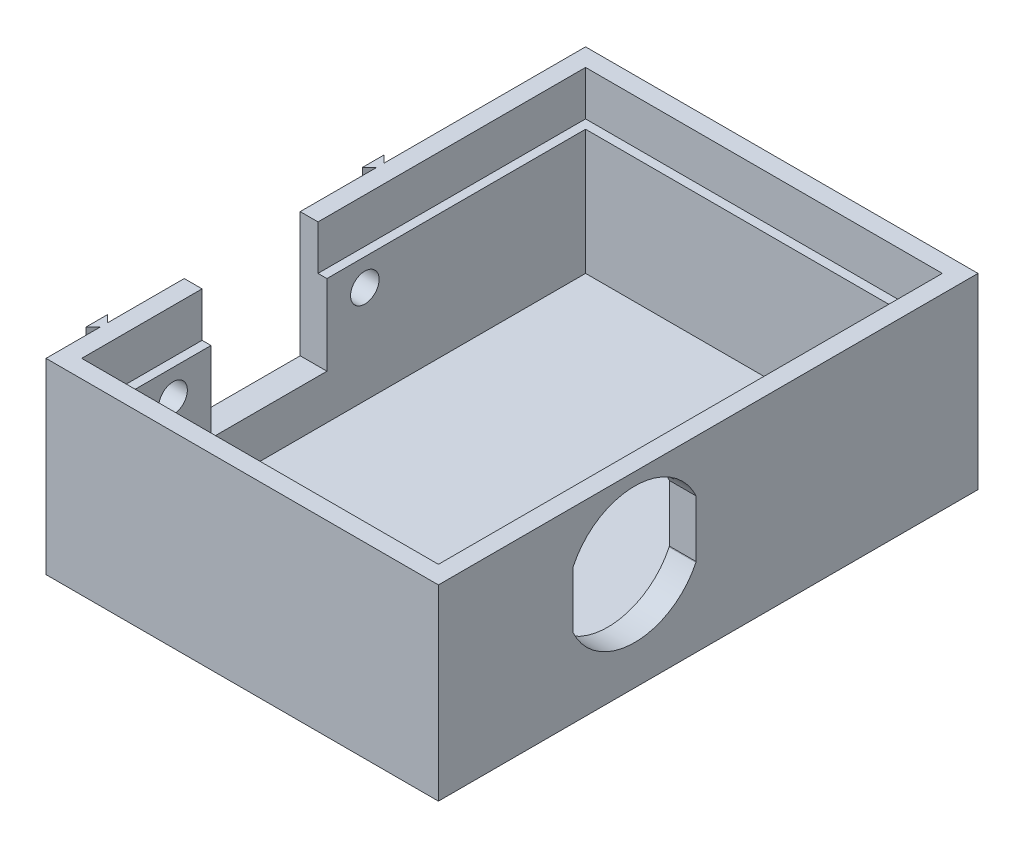
ISO-10303-21;
HEADER;
FILE_DESCRIPTION(('STEP AP214'),'2;1');
FILE_NAME('part.step','',(''),(''),'','','');
FILE_SCHEMA(('AUTOMOTIVE_DESIGN { 1 0 10303 214 1 1 1 1 }'));
ENDSEC;
DATA;
#1=APPLICATION_CONTEXT('core data for automotive mechanical design processes');
#2=APPLICATION_PROTOCOL_DEFINITION('international standard','automotive_design',2000,#1);
#3=PRODUCT_CONTEXT('',#1,'mechanical');
#4=PRODUCT('Part','Part','',(#3));
#5=PRODUCT_RELATED_PRODUCT_CATEGORY('part','',(#4));
#6=PRODUCT_DEFINITION_FORMATION('','',#4);
#7=PRODUCT_DEFINITION_CONTEXT('part definition',#1,'design');
#8=PRODUCT_DEFINITION('design','',#6,#7);
#9=PRODUCT_DEFINITION_SHAPE('','',#8);
#10=(LENGTH_UNIT() NAMED_UNIT(*) SI_UNIT(.MILLI.,.METRE.));
#11=(NAMED_UNIT(*) PLANE_ANGLE_UNIT() SI_UNIT($,.RADIAN.));
#12=(NAMED_UNIT(*) SI_UNIT($,.STERADIAN.) SOLID_ANGLE_UNIT());
#13=UNCERTAINTY_MEASURE_WITH_UNIT(LENGTH_MEASURE(1.E-05),#10,'distance_accuracy_value','');
#14=(GEOMETRIC_REPRESENTATION_CONTEXT(3) GLOBAL_UNCERTAINTY_ASSIGNED_CONTEXT((#13)) GLOBAL_UNIT_ASSIGNED_CONTEXT((#10,
#11,#12)) REPRESENTATION_CONTEXT('',''));
#15=CARTESIAN_POINT('',(0.,0.,0.));
#16=DIRECTION('',(0.,0.,1.));
#17=DIRECTION('',(1.,0.,0.));
#18=AXIS2_PLACEMENT_3D('',#15,#16,#17);
#19=CARTESIAN_POINT('',(0.,16.,0.));
#20=DIRECTION('',(0.,1.,0.));
#21=DIRECTION('',(0.,0.,1.));
#22=AXIS2_PLACEMENT_3D('',#19,#20,#21);
#23=PLANE('',#22);
#24=DIRECTION('',(1.,0.,0.));
#25=VECTOR('',#24,1.);
#26=CARTESIAN_POINT('',(12.,16.,-1.76823879571511));
#27=LINE('',#26,#25);
#28=CARTESIAN_POINT('',(19.,16.,-1.76823879571511));
#29=VERTEX_POINT('',#28);
#30=CARTESIAN_POINT('',(20.,16.,-1.76823879571511));
#31=VERTEX_POINT('',#30);
#32=EDGE_CURVE('E60',#29,#31,#27,.T.);
#33=ORIENTED_EDGE('',*,*,#32,.F.);
#34=DIRECTION('',(0.,0.,-1.));
#35=VECTOR('',#34,1.);
#36=CARTESIAN_POINT('',(19.,16.,10.7695634357235));
#37=LINE('',#36,#35);
#38=CARTESIAN_POINT('',(19.,16.,10.7695634357235));
#39=VERTEX_POINT('',#38);
#40=EDGE_CURVE('E354',#39,#29,#37,.T.);
#41=ORIENTED_EDGE('',*,*,#40,.F.);
#42=DIRECTION('',(1.,0.,0.));
#43=VECTOR('',#42,1.);
#44=CARTESIAN_POINT('',(-19.,16.,10.7695634357235));
#45=LINE('',#44,#43);
#46=CARTESIAN_POINT('',(-19.,16.,10.7695634357235));
#47=VERTEX_POINT('',#46);
#48=EDGE_CURVE('E350',#47,#39,#45,.T.);
#49=ORIENTED_EDGE('',*,*,#48,.F.);
#50=DIRECTION('',(0.,0.,1.));
#51=VECTOR('',#50,1.);
#52=CARTESIAN_POINT('',(-19.,16.,10.7695634357235));
#53=LINE('',#52,#51);
#54=CARTESIAN_POINT('',(-19.,16.,-1.73043656427652));
#55=VERTEX_POINT('',#54);
#56=EDGE_CURVE('E340',#55,#47,#53,.T.);
#57=ORIENTED_EDGE('',*,*,#56,.F.);
#58=DIRECTION('',(-1.,0.,0.));
#59=VECTOR('',#58,1.);
#60=CARTESIAN_POINT('',(-22.,16.,-1.73043656427652));
#61=LINE('',#60,#59);
#62=CARTESIAN_POINT('',(-20.,16.,-1.73043656427652));
#63=VERTEX_POINT('',#62);
#64=EDGE_CURVE('E400',#55,#63,#61,.T.);
#65=ORIENTED_EDGE('',*,*,#64,.T.);
#66=DIRECTION('',(0.,0.,1.));
#67=VECTOR('',#66,1.);
#68=CARTESIAN_POINT('',(-20.,16.,11.7695634357235));
#69=LINE('',#68,#67);
#70=CARTESIAN_POINT('',(-20.,16.,11.7695634357235));
#71=VERTEX_POINT('',#70);
#72=EDGE_CURVE('E372',#63,#71,#69,.T.);
#73=ORIENTED_EDGE('',*,*,#72,.T.);
#74=DIRECTION('',(1.,0.,0.));
#75=VECTOR('',#74,1.);
#76=CARTESIAN_POINT('',(-20.,16.,11.7695634357235));
#77=LINE('',#76,#75);
#78=CARTESIAN_POINT('',(20.,16.,11.7695634357235));
#79=VERTEX_POINT('',#78);
#80=EDGE_CURVE('E361',#71,#79,#77,.T.);
#81=ORIENTED_EDGE('',*,*,#80,.T.);
#82=DIRECTION('',(0.,0.,-1.));
#83=VECTOR('',#82,1.);
#84=CARTESIAN_POINT('',(20.,16.,11.7695634357235));
#85=LINE('',#84,#83);
#86=EDGE_CURVE('E366',#79,#31,#85,.T.);
#87=ORIENTED_EDGE('',*,*,#86,.T.);
#88=EDGE_LOOP('',(#33,#41,#49,#57,#65,#73,#81,#87));
#89=FACE_BOUND('',#88,.T.);
#90=ADVANCED_FACE('F35',(#89),#23,.T.);
#91=CARTESIAN_POINT('',(-22.,2.,13.7695634357235));
#92=DIRECTION('',(1.,0.,0.));
#93=DIRECTION('',(0.,0.,-1.));
#94=AXIS2_PLACEMENT_3D('',#91,#92,#93);
#95=PLANE('',#94);
#96=CARTESIAN_POINT('',(-22.,13.,-18.9804365642765));
#97=DIRECTION('',(-1.,0.,0.));
#98=DIRECTION('',(0.,0.,1.));
#99=AXIS2_PLACEMENT_3D('',#96,#97,#98);
#100=CIRCLE('',#99,1.6);
#101=CARTESIAN_POINT('',(-22.,13.,-17.3804365642765));
#102=VERTEX_POINT('',#101);
#103=EDGE_CURVE('E507',#102,#102,#100,.T.);
#104=ORIENTED_EDGE('',*,*,#103,.F.);
#105=EDGE_LOOP('',(#104));
#106=FACE_BOUND('',#105,.T.);
#107=CARTESIAN_POINT('',(-22.,13.,2.51956343572347));
#108=DIRECTION('',(-1.,0.,0.));
#109=DIRECTION('',(0.,0.,-1.));
#110=AXIS2_PLACEMENT_3D('',#107,#108,#109);
#111=CIRCLE('',#110,1.6);
#112=CARTESIAN_POINT('',(-22.,13.,0.919563435723472));
#113=VERTEX_POINT('',#112);
#114=EDGE_CURVE('E512',#113,#113,#111,.T.);
#115=ORIENTED_EDGE('',*,*,#114,.F.);
#116=EDGE_LOOP('',(#115));
#117=FACE_BOUND('',#116,.T.);
#118=DIRECTION('',(0.,0.,1.));
#119=VECTOR('',#118,1.);
#120=CARTESIAN_POINT('',(-22.,4.4,13.7695634357235));
#121=LINE('',#120,#119);
#122=CARTESIAN_POINT('',(-22.,4.4,7.66956343572348));
#123=VERTEX_POINT('',#122);
#124=CARTESIAN_POINT('',(-22.,4.4,6.86956343572347));
#125=VERTEX_POINT('',#124);
#126=EDGE_CURVE('E494',#123,#125,#121,.F.);
#127=ORIENTED_EDGE('',*,*,#126,.T.);
#128=DIRECTION('',(0.,1.,0.));
#129=VECTOR('',#128,1.);
#130=CARTESIAN_POINT('',(-22.,6.,6.86956343572347));
#131=LINE('',#130,#129);
#132=CARTESIAN_POINT('',(-22.,21.,6.86956343572347));
#133=VERTEX_POINT('',#132);
#134=EDGE_CURVE('E329',#125,#133,#131,.T.);
#135=ORIENTED_EDGE('',*,*,#134,.T.);
#136=DIRECTION('',(0.,0.,1.));
#137=VECTOR('',#136,1.);
#138=CARTESIAN_POINT('',(-22.,21.,13.7695634357235));
#139=LINE('',#138,#137);
#140=CARTESIAN_POINT('',(-22.,21.,-1.73043656427652));
#141=VERTEX_POINT('',#140);
#142=EDGE_CURVE('E434',#141,#133,#139,.T.);
#143=ORIENTED_EDGE('',*,*,#142,.F.);
#144=DIRECTION('',(0.,-1.,0.));
#145=VECTOR('',#144,1.);
#146=CARTESIAN_POINT('',(-22.,21.,-1.73043656427652));
#147=LINE('',#146,#145);
#148=CARTESIAN_POINT('',(-22.,7.,-1.73043656427652));
#149=VERTEX_POINT('',#148);
#150=EDGE_CURVE('E440',#141,#149,#147,.T.);
#151=ORIENTED_EDGE('',*,*,#150,.T.);
#152=DIRECTION('',(0.,0.,1.));
#153=VECTOR('',#152,1.);
#154=CARTESIAN_POINT('',(-22.,7.,-14.7304365642765));
#155=LINE('',#154,#153);
#156=CARTESIAN_POINT('',(-22.,7.,-14.7304365642765));
#157=VERTEX_POINT('',#156);
#158=EDGE_CURVE('E410',#157,#149,#155,.T.);
#159=ORIENTED_EDGE('',*,*,#158,.F.);
#160=DIRECTION('',(0.,-1.,0.));
#161=VECTOR('',#160,1.);
#162=CARTESIAN_POINT('',(-22.,21.,-14.7304365642765));
#163=LINE('',#162,#161);
#164=CARTESIAN_POINT('',(-22.,21.,-14.7304365642765));
#165=VERTEX_POINT('',#164);
#166=EDGE_CURVE('E465',#165,#157,#163,.T.);
#167=ORIENTED_EDGE('',*,*,#166,.F.);
#168=DIRECTION('',(0.,0.,1.));
#169=VECTOR('',#168,1.);
#170=CARTESIAN_POINT('',(-22.,21.,-14.7304365642765));
#171=LINE('',#170,#169);
#172=CARTESIAN_POINT('',(-22.,21.,-23.3304365642765));
#173=VERTEX_POINT('',#172);
#174=EDGE_CURVE('E424',#173,#165,#171,.T.);
#175=ORIENTED_EDGE('',*,*,#174,.F.);
#176=DIRECTION('',(0.,1.,0.));
#177=VECTOR('',#176,1.);
#178=CARTESIAN_POINT('',(-22.,6.,-23.3304365642765));
#179=LINE('',#178,#177);
#180=CARTESIAN_POINT('',(-22.,4.39999999999999,-23.3304365642765));
#181=VERTEX_POINT('',#180);
#182=EDGE_CURVE('E320',#181,#173,#179,.T.);
#183=ORIENTED_EDGE('',*,*,#182,.F.);
#184=DIRECTION('',(0.,0.,-1.));
#185=VECTOR('',#184,1.);
#186=CARTESIAN_POINT('',(-22.,4.39999999999999,13.7695634357235));
#187=LINE('',#186,#185);
#188=CARTESIAN_POINT('',(-22.,4.39999999999999,-24.1304365642765));
#189=VERTEX_POINT('',#188);
#190=EDGE_CURVE('E491',#181,#189,#187,.T.);
#191=ORIENTED_EDGE('',*,*,#190,.T.);
#192=DIRECTION('',(0.,1.,0.));
#193=VECTOR('',#192,1.);
#194=CARTESIAN_POINT('',(-22.,6.,-24.1304365642765));
#195=LINE('',#194,#193);
#196=CARTESIAN_POINT('',(-22.,21.,-24.1304365642765));
#197=VERTEX_POINT('',#196);
#198=EDGE_CURVE('E316',#189,#197,#195,.T.);
#199=ORIENTED_EDGE('',*,*,#198,.T.);
#200=CARTESIAN_POINT('',(-22.,21.,-46.7304365642765));
#201=VERTEX_POINT('',#200);
#202=EDGE_CURVE('E425',#201,#197,#171,.T.);
#203=ORIENTED_EDGE('',*,*,#202,.F.);
#204=DIRECTION('',(0.,-1.,0.));
#205=VECTOR('',#204,1.);
#206=CARTESIAN_POINT('',(-22.,2.,-46.7304365642765));
#207=LINE('',#206,#205);
#208=CARTESIAN_POINT('',(-22.,0.,-46.7304365642765));
#209=VERTEX_POINT('',#208);
#210=EDGE_CURVE('E482',#201,#209,#207,.T.);
#211=ORIENTED_EDGE('',*,*,#210,.T.);
#212=DIRECTION('',(0.,0.,1.));
#213=VECTOR('',#212,1.);
#214=CARTESIAN_POINT('',(-22.,0.,13.7695634357235));
#215=LINE('',#214,#213);
#216=CARTESIAN_POINT('',(-22.,0.,13.7695634357235));
#217=VERTEX_POINT('',#216);
#218=EDGE_CURVE('E472',#209,#217,#215,.T.);
#219=ORIENTED_EDGE('',*,*,#218,.T.);
#220=DIRECTION('',(0.,-1.,0.));
#221=VECTOR('',#220,1.);
#222=CARTESIAN_POINT('',(-22.,2.,13.7695634357235));
#223=LINE('',#222,#221);
#224=CARTESIAN_POINT('',(-22.,21.,13.7695634357235));
#225=VERTEX_POINT('',#224);
#226=EDGE_CURVE('E479',#225,#217,#223,.T.);
#227=ORIENTED_EDGE('',*,*,#226,.F.);
#228=CARTESIAN_POINT('',(-22.,21.,7.66956343572348));
#229=VERTEX_POINT('',#228);
#230=EDGE_CURVE('E433',#229,#225,#139,.T.);
#231=ORIENTED_EDGE('',*,*,#230,.F.);
#232=DIRECTION('',(0.,1.,0.));
#233=VECTOR('',#232,1.);
#234=CARTESIAN_POINT('',(-22.,6.,7.66956343572348));
#235=LINE('',#234,#233);
#236=EDGE_CURVE('E338',#123,#229,#235,.T.);
#237=ORIENTED_EDGE('',*,*,#236,.F.);
#238=EDGE_LOOP('',(#127,#135,#143,#151,#159,#167,#175,#183,#191,#199,#203,#211,#219,#227,#231,#237));
#239=FACE_BOUND('',#238,.T.);
#240=ADVANCED_FACE('F523',(#106,#117,#239),#95,.F.);
#241=CARTESIAN_POINT('',(-19.,21.,-14.7304365642765));
#242=DIRECTION('',(-1.,0.,0.));
#243=DIRECTION('',(0.,0.,1.));
#244=AXIS2_PLACEMENT_3D('',#241,#242,#243);
#245=PLANE('',#244);
#246=CARTESIAN_POINT('',(-19.,13.,-18.9804365642765));
#247=DIRECTION('',(-1.,0.,0.));
#248=DIRECTION('',(0.,0.,1.));
#249=AXIS2_PLACEMENT_3D('',#246,#247,#248);
#250=CIRCLE('',#249,1.6);
#251=CARTESIAN_POINT('',(-19.,13.,-17.3804365642765));
#252=VERTEX_POINT('',#251);
#253=EDGE_CURVE('E39',#252,#252,#250,.T.);
#254=ORIENTED_EDGE('',*,*,#253,.T.);
#255=EDGE_LOOP('',(#254));
#256=FACE_BOUND('',#255,.T.);
#257=CARTESIAN_POINT('',(-19.,13.,2.51956343572347));
#258=DIRECTION('',(-1.,0.,0.));
#259=DIRECTION('',(0.,0.,1.));
#260=AXIS2_PLACEMENT_3D('',#257,#258,#259);
#261=CIRCLE('',#260,1.6);
#262=CARTESIAN_POINT('',(-19.,13.,4.11956343572348));
#263=VERTEX_POINT('',#262);
#264=EDGE_CURVE('E505',#263,#263,#261,.T.);
#265=ORIENTED_EDGE('',*,*,#264,.T.);
#266=EDGE_LOOP('',(#265));
#267=FACE_BOUND('',#266,.T.);
#268=ORIENTED_EDGE('',*,*,#56,.T.);
#269=DIRECTION('',(0.,-1.,0.));
#270=VECTOR('',#269,1.);
#271=CARTESIAN_POINT('',(-19.,21.,10.7695634357235));
#272=LINE('',#271,#270);
#273=CARTESIAN_POINT('',(-19.,2.,10.7695634357235));
#274=VERTEX_POINT('',#273);
#275=EDGE_CURVE('E455',#47,#274,#272,.T.);
#276=ORIENTED_EDGE('',*,*,#275,.T.);
#277=DIRECTION('',(0.,0.,-1.));
#278=VECTOR('',#277,1.);
#279=CARTESIAN_POINT('',(-19.,2.,-14.7304365642765));
#280=LINE('',#279,#278);
#281=CARTESIAN_POINT('',(-19.,2.,-43.7304365642765));
#282=VERTEX_POINT('',#281);
#283=EDGE_CURVE('E416',#274,#282,#280,.T.);
#284=ORIENTED_EDGE('',*,*,#283,.T.);
#285=DIRECTION('',(0.,-1.,0.));
#286=VECTOR('',#285,1.);
#287=CARTESIAN_POINT('',(-19.,21.,-43.7304365642765));
#288=LINE('',#287,#286);
#289=CARTESIAN_POINT('',(-19.,16.,-43.7304365642765));
#290=VERTEX_POINT('',#289);
#291=EDGE_CURVE('E461',#290,#282,#288,.T.);
#292=ORIENTED_EDGE('',*,*,#291,.F.);
#293=CARTESIAN_POINT('',(-19.,16.,-14.7304365642765));
#294=VERTEX_POINT('',#293);
#295=EDGE_CURVE('E347',#290,#294,#53,.T.);
#296=ORIENTED_EDGE('',*,*,#295,.T.);
#297=DIRECTION('',(0.,-1.,0.));
#298=VECTOR('',#297,1.);
#299=CARTESIAN_POINT('',(-19.,21.,-14.7304365642765));
#300=LINE('',#299,#298);
#301=CARTESIAN_POINT('',(-19.,7.,-14.7304365642765));
#302=VERTEX_POINT('',#301);
#303=EDGE_CURVE('E463',#294,#302,#300,.T.);
#304=ORIENTED_EDGE('',*,*,#303,.T.);
#305=DIRECTION('',(0.,0.,-1.));
#306=VECTOR('',#305,1.);
#307=CARTESIAN_POINT('',(-19.,7.,-14.7304365642765));
#308=LINE('',#307,#306);
#309=CARTESIAN_POINT('',(-19.,7.,-1.73043656427652));
#310=VERTEX_POINT('',#309);
#311=EDGE_CURVE('E404',#310,#302,#308,.T.);
#312=ORIENTED_EDGE('',*,*,#311,.F.);
#313=DIRECTION('',(0.,-1.,0.));
#314=VECTOR('',#313,1.);
#315=CARTESIAN_POINT('',(-19.,21.,-1.73043656427652));
#316=LINE('',#315,#314);
#317=EDGE_CURVE('E453',#55,#310,#316,.T.);
#318=ORIENTED_EDGE('',*,*,#317,.F.);
#319=EDGE_LOOP('',(#268,#276,#284,#292,#296,#304,#312,#318));
#320=FACE_BOUND('',#319,.T.);
#321=ADVANCED_FACE('F526',(#256,#267,#320),#245,.F.);
#322=CARTESIAN_POINT('',(-19.,21.,-43.7304365642765));
#323=DIRECTION('',(0.,0.,-1.));
#324=DIRECTION('',(-1.,0.,0.));
#325=AXIS2_PLACEMENT_3D('',#322,#323,#324);
#326=PLANE('',#325);
#327=DIRECTION('',(-1.,0.,0.));
#328=VECTOR('',#327,1.);
#329=CARTESIAN_POINT('',(-19.,16.,-43.7304365642765));
#330=LINE('',#329,#328);
#331=CARTESIAN_POINT('',(19.,16.,-43.7304365642765));
#332=VERTEX_POINT('',#331);
#333=EDGE_CURVE('E357',#332,#290,#330,.T.);
#334=ORIENTED_EDGE('',*,*,#333,.T.);
#335=ORIENTED_EDGE('',*,*,#291,.T.);
#336=DIRECTION('',(1.,0.,0.));
#337=VECTOR('',#336,1.);
#338=CARTESIAN_POINT('',(-19.,2.,-43.7304365642765));
#339=LINE('',#338,#337);
#340=CARTESIAN_POINT('',(19.,2.,-43.7304365642765));
#341=VERTEX_POINT('',#340);
#342=EDGE_CURVE('E443',#282,#341,#339,.T.);
#343=ORIENTED_EDGE('',*,*,#342,.T.);
#344=DIRECTION('',(0.,-1.,0.));
#345=VECTOR('',#344,1.);
#346=CARTESIAN_POINT('',(19.,21.,-43.7304365642765));
#347=LINE('',#346,#345);
#348=EDGE_CURVE('E459',#332,#341,#347,.T.);
#349=ORIENTED_EDGE('',*,*,#348,.F.);
#350=EDGE_LOOP('',(#334,#335,#343,#349));
#351=FACE_BOUND('',#350,.T.);
#352=ADVANCED_FACE('F635',(#351),#326,.F.);
#353=CARTESIAN_POINT('',(19.,21.,10.7695634357235));
#354=DIRECTION('',(1.,0.,0.));
#355=DIRECTION('',(0.,0.,-1.));
#356=AXIS2_PLACEMENT_3D('',#353,#354,#355);
#357=PLANE('',#356);
#358=DIRECTION('',(0.,1.,0.));
#359=VECTOR('',#358,1.);
#360=CARTESIAN_POINT('',(19.,21.,-15.1304365642765));
#361=LINE('',#360,#359);
#362=CARTESIAN_POINT('',(19.,8.8140935355852,-15.1304365642765));
#363=VERTEX_POINT('',#362);
#364=CARTESIAN_POINT('',(19.,15.1859064644148,-15.1304365642765));
#365=VERTEX_POINT('',#364);
#366=EDGE_CURVE('E301',#363,#365,#361,.T.);
#367=ORIENTED_EDGE('',*,*,#366,.T.);
#368=CARTESIAN_POINT('',(19.,12.,-8.23043656427652));
#369=DIRECTION('',(1.,0.,0.));
#370=DIRECTION('',(0.,0.,-1.));
#371=AXIS2_PLACEMENT_3D('',#368,#369,#370);
#372=CIRCLE('',#371,7.6);
#373=CARTESIAN_POINT('',(19.,16.,-14.6926343328379));
#374=VERTEX_POINT('',#373);
#375=EDGE_CURVE('E293',#365,#374,#372,.T.);
#376=ORIENTED_EDGE('',*,*,#375,.T.);
#377=EDGE_CURVE('E353',#374,#332,#37,.T.);
#378=ORIENTED_EDGE('',*,*,#377,.T.);
#379=ORIENTED_EDGE('',*,*,#348,.T.);
#380=DIRECTION('',(0.,0.,1.));
#381=VECTOR('',#380,1.);
#382=CARTESIAN_POINT('',(19.,2.,10.7695634357235));
#383=LINE('',#382,#381);
#384=CARTESIAN_POINT('',(19.,2.,10.7695634357235));
#385=VERTEX_POINT('',#384);
#386=EDGE_CURVE('E446',#341,#385,#383,.T.);
#387=ORIENTED_EDGE('',*,*,#386,.T.);
#388=DIRECTION('',(0.,-1.,0.));
#389=VECTOR('',#388,1.);
#390=CARTESIAN_POINT('',(19.,21.,10.7695634357235));
#391=LINE('',#390,#389);
#392=EDGE_CURVE('E457',#39,#385,#391,.T.);
#393=ORIENTED_EDGE('',*,*,#392,.F.);
#394=ORIENTED_EDGE('',*,*,#40,.T.);
#395=CARTESIAN_POINT('',(19.,15.1859064644148,-1.33043656427652));
#396=VERTEX_POINT('',#395);
#397=EDGE_CURVE('E291',#29,#396,#372,.T.);
#398=ORIENTED_EDGE('',*,*,#397,.T.);
#399=DIRECTION('',(0.,1.,0.));
#400=VECTOR('',#399,1.);
#401=CARTESIAN_POINT('',(19.,21.,-1.33043656427652));
#402=LINE('',#401,#400);
#403=CARTESIAN_POINT('',(19.,8.8140935355852,-1.33043656427652));
#404=VERTEX_POINT('',#403);
#405=EDGE_CURVE('E260',#404,#396,#402,.T.);
#406=ORIENTED_EDGE('',*,*,#405,.F.);
#407=CARTESIAN_POINT('',(19.,12.,-8.23043656427652));
#408=DIRECTION('',(1.,0.,0.));
#409=DIRECTION('',(0.,0.,-1.));
#410=AXIS2_PLACEMENT_3D('',#407,#408,#409);
#411=CIRCLE('',#410,7.6);
#412=CARTESIAN_POINT('',(19.,8.74461248397559,-15.0979289829482));
#413=VERTEX_POINT('',#412);
#414=EDGE_CURVE('E295',#404,#413,#411,.T.);
#415=ORIENTED_EDGE('',*,*,#414,.T.);
#416=DIRECTION('',(0.,0.905767614750069,-0.423774737413606));
#417=VECTOR('',#416,1.);
#418=CARTESIAN_POINT('',(19.,8.87010052827993,-15.156640138169));
#419=LINE('',#418,#417);
#420=EDGE_CURVE('E298',#413,#363,#419,.T.);
#421=ORIENTED_EDGE('',*,*,#420,.T.);
#422=EDGE_LOOP('',(#367,#376,#378,#379,#387,#393,#394,#398,#406,#415,#421));
#423=FACE_BOUND('',#422,.T.);
#424=ADVANCED_FACE('F643',(#423),#357,.F.);
#425=CARTESIAN_POINT('',(-19.,21.,10.7695634357235));
#426=DIRECTION('',(0.,0.,1.));
#427=DIRECTION('',(1.,0.,0.));
#428=AXIS2_PLACEMENT_3D('',#425,#426,#427);
#429=PLANE('',#428);
#430=ORIENTED_EDGE('',*,*,#48,.T.);
#431=ORIENTED_EDGE('',*,*,#392,.T.);
#432=DIRECTION('',(-1.,0.,0.));
#433=VECTOR('',#432,1.);
#434=CARTESIAN_POINT('',(-19.,2.,10.7695634357235));
#435=LINE('',#434,#433);
#436=EDGE_CURVE('E421',#385,#274,#435,.T.);
#437=ORIENTED_EDGE('',*,*,#436,.T.);
#438=ORIENTED_EDGE('',*,*,#275,.F.);
#439=EDGE_LOOP('',(#430,#431,#437,#438));
#440=FACE_BOUND('',#439,.T.);
#441=ADVANCED_FACE('F784',(#440),#429,.F.);
#442=CARTESIAN_POINT('',(0.,2.,0.));
#443=DIRECTION('',(0.,-1.,0.));
#444=DIRECTION('',(0.,0.,-1.));
#445=AXIS2_PLACEMENT_3D('',#442,#443,#444);
#446=PLANE('',#445);
#447=ORIENTED_EDGE('',*,*,#283,.F.);
#448=ORIENTED_EDGE('',*,*,#436,.F.);
#449=ORIENTED_EDGE('',*,*,#386,.F.);
#450=ORIENTED_EDGE('',*,*,#342,.F.);
#451=EDGE_LOOP('',(#447,#448,#449,#450));
#452=FACE_BOUND('',#451,.T.);
#453=ADVANCED_FACE('F639',(#452),#446,.F.);
#454=CARTESIAN_POINT('',(-22.,21.,-14.7304365642765));
#455=DIRECTION('',(0.,0.,-1.));
#456=DIRECTION('',(-1.,0.,0.));
#457=AXIS2_PLACEMENT_3D('',#454,#455,#456);
#458=PLANE('',#457);
#459=DIRECTION('',(1.,0.,0.));
#460=VECTOR('',#459,1.);
#461=CARTESIAN_POINT('',(-22.,16.,-14.7304365642765));
#462=LINE('',#461,#460);
#463=CARTESIAN_POINT('',(-20.,16.,-14.7304365642765));
#464=VERTEX_POINT('',#463);
#465=EDGE_CURVE('E402',#464,#294,#462,.T.);
#466=ORIENTED_EDGE('',*,*,#465,.F.);
#467=DIRECTION('',(0.,1.,0.));
#468=VECTOR('',#467,1.);
#469=CARTESIAN_POINT('',(-20.,21.,-14.7304365642765));
#470=LINE('',#469,#468);
#471=CARTESIAN_POINT('',(-20.,21.,-14.7304365642765));
#472=VERTEX_POINT('',#471);
#473=EDGE_CURVE('E397',#464,#472,#470,.T.);
#474=ORIENTED_EDGE('',*,*,#473,.T.);
#475=DIRECTION('',(1.,0.,0.));
#476=VECTOR('',#475,1.);
#477=CARTESIAN_POINT('',(-22.,21.,-14.7304365642765));
#478=LINE('',#477,#476);
#479=EDGE_CURVE('E428',#165,#472,#478,.T.);
#480=ORIENTED_EDGE('',*,*,#479,.F.);
#481=ORIENTED_EDGE('',*,*,#166,.T.);
#482=DIRECTION('',(-1.,0.,0.));
#483=VECTOR('',#482,1.);
#484=CARTESIAN_POINT('',(-19.,7.,-14.7304365642765));
#485=LINE('',#484,#483);
#486=EDGE_CURVE('E407',#302,#157,#485,.T.);
#487=ORIENTED_EDGE('',*,*,#486,.F.);
#488=ORIENTED_EDGE('',*,*,#303,.F.);
#489=EDGE_LOOP('',(#466,#474,#480,#481,#487,#488));
#490=FACE_BOUND('',#489,.T.);
#491=ADVANCED_FACE('F559',(#490),#458,.F.);
#492=CARTESIAN_POINT('',(-22.,21.,-1.73043656427652));
#493=DIRECTION('',(0.,0.,1.));
#494=DIRECTION('',(1.,0.,0.));
#495=AXIS2_PLACEMENT_3D('',#492,#493,#494);
#496=PLANE('',#495);
#497=DIRECTION('',(-1.,0.,0.));
#498=VECTOR('',#497,1.);
#499=CARTESIAN_POINT('',(-22.,21.,-1.73043656427652));
#500=LINE('',#499,#498);
#501=CARTESIAN_POINT('',(-20.,21.,-1.73043656427652));
#502=VERTEX_POINT('',#501);
#503=EDGE_CURVE('E431',#502,#141,#500,.T.);
#504=ORIENTED_EDGE('',*,*,#503,.F.);
#505=DIRECTION('',(0.,-1.,0.));
#506=VECTOR('',#505,1.);
#507=CARTESIAN_POINT('',(-20.,21.,-1.73043656427652));
#508=LINE('',#507,#506);
#509=EDGE_CURVE('E388',#502,#63,#508,.T.);
#510=ORIENTED_EDGE('',*,*,#509,.T.);
#511=ORIENTED_EDGE('',*,*,#64,.F.);
#512=ORIENTED_EDGE('',*,*,#317,.T.);
#513=DIRECTION('',(1.,0.,0.));
#514=VECTOR('',#513,1.);
#515=CARTESIAN_POINT('',(-19.,7.,-1.73043656427652));
#516=LINE('',#515,#514);
#517=EDGE_CURVE('E413',#149,#310,#516,.T.);
#518=ORIENTED_EDGE('',*,*,#517,.F.);
#519=ORIENTED_EDGE('',*,*,#150,.F.);
#520=EDGE_LOOP('',(#504,#510,#511,#512,#518,#519));
#521=FACE_BOUND('',#520,.T.);
#522=ADVANCED_FACE('F588',(#521),#496,.F.);
#523=CARTESIAN_POINT('',(22.,2.,13.7695634357235));
#524=DIRECTION('',(-1.,0.,0.));
#525=DIRECTION('',(0.,0.,1.));
#526=AXIS2_PLACEMENT_3D('',#523,#524,#525);
#527=PLANE('',#526);
#528=CARTESIAN_POINT('',(22.,12.,-8.23043656427652));
#529=DIRECTION('',(1.,0.,0.));
#530=DIRECTION('',(0.,0.,-1.));
#531=AXIS2_PLACEMENT_3D('',#528,#529,#530);
#532=CIRCLE('',#531,7.6);
#533=CARTESIAN_POINT('',(22.,15.1859064644148,-15.1304365642765));
#534=VERTEX_POINT('',#533);
#535=CARTESIAN_POINT('',(22.,15.1859064644148,-1.33043656427652));
#536=VERTEX_POINT('',#535);
#537=EDGE_CURVE('E266',#534,#536,#532,.T.);
#538=ORIENTED_EDGE('',*,*,#537,.F.);
#539=DIRECTION('',(0.,1.,0.));
#540=VECTOR('',#539,1.);
#541=CARTESIAN_POINT('',(22.,0.,-15.1304365642765));
#542=LINE('',#541,#540);
#543=CARTESIAN_POINT('',(22.,8.8140935355852,-15.1304365642765));
#544=VERTEX_POINT('',#543);
#545=EDGE_CURVE('E52',#544,#534,#542,.T.);
#546=ORIENTED_EDGE('',*,*,#545,.F.);
#547=DIRECTION('',(0.,0.905767614750069,-0.423774737413606));
#548=VECTOR('',#547,1.);
#549=CARTESIAN_POINT('',(22.,-4.22480921923781,-9.03002239500712));
#550=LINE('',#549,#548);
#551=CARTESIAN_POINT('',(22.,8.74461248397559,-15.0979289829482));
#552=VERTEX_POINT('',#551);
#553=EDGE_CURVE('E276',#552,#544,#550,.T.);
#554=ORIENTED_EDGE('',*,*,#553,.F.);
#555=CARTESIAN_POINT('',(22.,12.,-8.23043656427652));
#556=DIRECTION('',(1.,0.,0.));
#557=DIRECTION('',(0.,0.,-1.));
#558=AXIS2_PLACEMENT_3D('',#555,#556,#557);
#559=CIRCLE('',#558,7.6);
#560=CARTESIAN_POINT('',(22.,8.8140935355852,-1.33043656427652));
#561=VERTEX_POINT('',#560);
#562=EDGE_CURVE('E274',#561,#552,#559,.T.);
#563=ORIENTED_EDGE('',*,*,#562,.F.);
#564=DIRECTION('',(0.,1.,0.));
#565=VECTOR('',#564,1.);
#566=CARTESIAN_POINT('',(22.,0.,-1.33043656427652));
#567=LINE('',#566,#565);
#568=EDGE_CURVE('E257',#561,#536,#567,.T.);
#569=ORIENTED_EDGE('',*,*,#568,.T.);
#570=EDGE_LOOP('',(#538,#546,#554,#563,#569));
#571=FACE_BOUND('',#570,.T.);
#572=DIRECTION('',(0.,0.,-1.));
#573=VECTOR('',#572,1.);
#574=CARTESIAN_POINT('',(22.,0.,13.7695634357235));
#575=LINE('',#574,#573);
#576=CARTESIAN_POINT('',(22.,0.,13.7695634357235));
#577=VERTEX_POINT('',#576);
#578=CARTESIAN_POINT('',(22.,0.,-46.7304365642765));
#579=VERTEX_POINT('',#578);
#580=EDGE_CURVE('E467',#577,#579,#575,.T.);
#581=ORIENTED_EDGE('',*,*,#580,.T.);
#582=DIRECTION('',(0.,-1.,0.));
#583=VECTOR('',#582,1.);
#584=CARTESIAN_POINT('',(22.,2.,-46.7304365642765));
#585=LINE('',#584,#583);
#586=CARTESIAN_POINT('',(22.,21.,-46.7304365642765));
#587=VERTEX_POINT('',#586);
#588=EDGE_CURVE('E485',#587,#579,#585,.T.);
#589=ORIENTED_EDGE('',*,*,#588,.F.);
#590=DIRECTION('',(0.,0.,-1.));
#591=VECTOR('',#590,1.);
#592=CARTESIAN_POINT('',(22.,21.,13.7695634357235));
#593=LINE('',#592,#591);
#594=CARTESIAN_POINT('',(22.,21.,13.7695634357235));
#595=VERTEX_POINT('',#594);
#596=EDGE_CURVE('E417',#595,#587,#593,.T.);
#597=ORIENTED_EDGE('',*,*,#596,.F.);
#598=DIRECTION('',(0.,-1.,0.));
#599=VECTOR('',#598,1.);
#600=CARTESIAN_POINT('',(22.,2.,13.7695634357235));
#601=LINE('',#600,#599);
#602=EDGE_CURVE('E476',#595,#577,#601,.T.);
#603=ORIENTED_EDGE('',*,*,#602,.T.);
#604=EDGE_LOOP('',(#581,#589,#597,#603));
#605=FACE_BOUND('',#604,.T.);
#606=ADVANCED_FACE('F270',(#571,#605),#527,.F.);
#607=CARTESIAN_POINT('',(-22.,2.,-46.7304365642765));
#608=DIRECTION('',(0.,0.,1.));
#609=DIRECTION('',(1.,0.,0.));
#610=AXIS2_PLACEMENT_3D('',#607,#608,#609);
#611=PLANE('',#610);
#612=DIRECTION('',(-1.,0.,0.));
#613=VECTOR('',#612,1.);
#614=CARTESIAN_POINT('',(-22.,0.,-46.7304365642765));
#615=LINE('',#614,#613);
#616=EDGE_CURVE('E470',#579,#209,#615,.T.);
#617=ORIENTED_EDGE('',*,*,#616,.T.);
#618=ORIENTED_EDGE('',*,*,#210,.F.);
#619=DIRECTION('',(-1.,0.,0.));
#620=VECTOR('',#619,1.);
#621=CARTESIAN_POINT('',(-22.,21.,-46.7304365642765));
#622=LINE('',#621,#620);
#623=EDGE_CURVE('E420',#587,#201,#622,.T.);
#624=ORIENTED_EDGE('',*,*,#623,.F.);
#625=ORIENTED_EDGE('',*,*,#588,.T.);
#626=EDGE_LOOP('',(#617,#618,#624,#625));
#627=FACE_BOUND('',#626,.T.);
#628=ADVANCED_FACE('F577',(#627),#611,.F.);
#629=CARTESIAN_POINT('',(-22.,2.,13.7695634357235));
#630=DIRECTION('',(0.,0.,-1.));
#631=DIRECTION('',(-1.,0.,0.));
#632=AXIS2_PLACEMENT_3D('',#629,#630,#631);
#633=PLANE('',#632);
#634=DIRECTION('',(1.,0.,0.));
#635=VECTOR('',#634,1.);
#636=CARTESIAN_POINT('',(-22.,0.,13.7695634357235));
#637=LINE('',#636,#635);
#638=EDGE_CURVE('E474',#217,#577,#637,.T.);
#639=ORIENTED_EDGE('',*,*,#638,.T.);
#640=ORIENTED_EDGE('',*,*,#602,.F.);
#641=DIRECTION('',(1.,0.,0.));
#642=VECTOR('',#641,1.);
#643=CARTESIAN_POINT('',(-22.,21.,13.7695634357235));
#644=LINE('',#643,#642);
#645=EDGE_CURVE('E437',#225,#595,#644,.T.);
#646=ORIENTED_EDGE('',*,*,#645,.F.);
#647=ORIENTED_EDGE('',*,*,#226,.T.);
#648=EDGE_LOOP('',(#639,#640,#646,#647));
#649=FACE_BOUND('',#648,.T.);
#650=ADVANCED_FACE('F585',(#649),#633,.F.);
#651=CARTESIAN_POINT('',(0.,0.,0.));
#652=DIRECTION('',(0.,-1.,0.));
#653=DIRECTION('',(0.,0.,-1.));
#654=AXIS2_PLACEMENT_3D('',#651,#652,#653);
#655=PLANE('',#654);
#656=ORIENTED_EDGE('',*,*,#580,.F.);
#657=ORIENTED_EDGE('',*,*,#638,.F.);
#658=ORIENTED_EDGE('',*,*,#218,.F.);
#659=ORIENTED_EDGE('',*,*,#616,.F.);
#660=EDGE_LOOP('',(#656,#657,#658,#659));
#661=FACE_BOUND('',#660,.T.);
#662=ADVANCED_FACE('F583',(#661),#655,.T.);
#663=CARTESIAN_POINT('',(0.,21.,0.));
#664=DIRECTION('',(0.,-1.,0.));
#665=DIRECTION('',(0.,0.,-1.));
#666=AXIS2_PLACEMENT_3D('',#663,#664,#665);
#667=PLANE('',#666);
#668=DIRECTION('',(1.,0.,0.));
#669=VECTOR('',#668,1.);
#670=CARTESIAN_POINT('',(-20.,21.,11.7695634357235));
#671=LINE('',#670,#669);
#672=CARTESIAN_POINT('',(-20.,21.,11.7695634357235));
#673=VERTEX_POINT('',#672);
#674=CARTESIAN_POINT('',(20.,21.,11.7695634357235));
#675=VERTEX_POINT('',#674);
#676=EDGE_CURVE('E360',#673,#675,#671,.T.);
#677=ORIENTED_EDGE('',*,*,#676,.F.);
#678=DIRECTION('',(0.,0.,-1.));
#679=VECTOR('',#678,1.);
#680=CARTESIAN_POINT('',(-20.,21.,0.));
#681=LINE('',#680,#679);
#682=EDGE_CURVE('E488',#673,#502,#681,.T.);
#683=ORIENTED_EDGE('',*,*,#682,.T.);
#684=ORIENTED_EDGE('',*,*,#503,.T.);
#685=ORIENTED_EDGE('',*,*,#142,.T.);
#686=DIRECTION('',(-0.707106781186549,0.,-0.707106781186546));
#687=VECTOR('',#686,1.);
#688=CARTESIAN_POINT('',(-22.,21.,6.86956343572347));
#689=LINE('',#688,#687);
#690=CARTESIAN_POINT('',(-22.8,21.,6.06956343572347));
#691=VERTEX_POINT('',#690);
#692=EDGE_CURVE('E319',#133,#691,#689,.T.);
#693=ORIENTED_EDGE('',*,*,#692,.T.);
#694=DIRECTION('',(0.,0.,1.));
#695=VECTOR('',#694,1.);
#696=CARTESIAN_POINT('',(-22.8,21.,6.06956343572347));
#697=LINE('',#696,#695);
#698=CARTESIAN_POINT('',(-22.8,21.,8.46956343572347));
#699=VERTEX_POINT('',#698);
#700=EDGE_CURVE('E333',#691,#699,#697,.T.);
#701=ORIENTED_EDGE('',*,*,#700,.T.);
#702=DIRECTION('',(0.707106781186549,0.,-0.707106781186546));
#703=VECTOR('',#702,1.);
#704=CARTESIAN_POINT('',(-22.8,21.,8.46956343572347));
#705=LINE('',#704,#703);
#706=EDGE_CURVE('E330',#699,#229,#705,.T.);
#707=ORIENTED_EDGE('',*,*,#706,.T.);
#708=ORIENTED_EDGE('',*,*,#230,.T.);
#709=ORIENTED_EDGE('',*,*,#645,.T.);
#710=ORIENTED_EDGE('',*,*,#596,.T.);
#711=ORIENTED_EDGE('',*,*,#623,.T.);
#712=ORIENTED_EDGE('',*,*,#202,.T.);
#713=DIRECTION('',(-0.707106781186549,0.,-0.707106781186546));
#714=VECTOR('',#713,1.);
#715=CARTESIAN_POINT('',(-22.8,21.,-24.9304365642765));
#716=LINE('',#715,#714);
#717=CARTESIAN_POINT('',(-22.8,21.,-24.9304365642765));
#718=VERTEX_POINT('',#717);
#719=EDGE_CURVE('E304',#197,#718,#716,.T.);
#720=ORIENTED_EDGE('',*,*,#719,.T.);
#721=DIRECTION('',(0.,0.,1.));
#722=VECTOR('',#721,1.);
#723=CARTESIAN_POINT('',(-22.8,21.,-22.5304365642765));
#724=LINE('',#723,#722);
#725=CARTESIAN_POINT('',(-22.8,21.,-22.5304365642765));
#726=VERTEX_POINT('',#725);
#727=EDGE_CURVE('E312',#718,#726,#724,.T.);
#728=ORIENTED_EDGE('',*,*,#727,.T.);
#729=DIRECTION('',(0.707106781186549,0.,-0.707106781186546));
#730=VECTOR('',#729,1.);
#731=CARTESIAN_POINT('',(-22.,21.,-23.3304365642765));
#732=LINE('',#731,#730);
#733=EDGE_CURVE('E309',#726,#173,#732,.T.);
#734=ORIENTED_EDGE('',*,*,#733,.T.);
#735=ORIENTED_EDGE('',*,*,#174,.T.);
#736=ORIENTED_EDGE('',*,*,#479,.T.);
#737=DIRECTION('',(0.,0.,1.));
#738=VECTOR('',#737,1.);
#739=CARTESIAN_POINT('',(-20.,21.,11.7695634357235));
#740=LINE('',#739,#738);
#741=CARTESIAN_POINT('',(-20.,21.,-44.7304365642765));
#742=VERTEX_POINT('',#741);
#743=EDGE_CURVE('E365',#742,#472,#740,.T.);
#744=ORIENTED_EDGE('',*,*,#743,.F.);
#745=DIRECTION('',(-1.,0.,0.));
#746=VECTOR('',#745,1.);
#747=CARTESIAN_POINT('',(-20.,21.,-44.7304365642765));
#748=LINE('',#747,#746);
#749=CARTESIAN_POINT('',(20.,21.,-44.7304365642765));
#750=VERTEX_POINT('',#749);
#751=EDGE_CURVE('E381',#750,#742,#748,.T.);
#752=ORIENTED_EDGE('',*,*,#751,.F.);
#753=DIRECTION('',(0.,0.,-1.));
#754=VECTOR('',#753,1.);
#755=CARTESIAN_POINT('',(20.,21.,11.7695634357235));
#756=LINE('',#755,#754);
#757=EDGE_CURVE('E378',#675,#750,#756,.T.);
#758=ORIENTED_EDGE('',*,*,#757,.F.);
#759=EDGE_LOOP('',(#677,#683,#684,#685,#693,#701,#707,#708,#709,#710,#711,#712,#720,#728,#734,
#735,#736,#744,#752,#758));
#760=FACE_BOUND('',#759,.T.);
#761=ADVANCED_FACE('F546',(#760),#667,.F.);
#762=CARTESIAN_POINT('',(0.,7.,0.));
#763=DIRECTION('',(0.,-1.,0.));
#764=DIRECTION('',(0.,0.,-1.));
#765=AXIS2_PLACEMENT_3D('',#762,#763,#764);
#766=PLANE('',#765);
#767=ORIENTED_EDGE('',*,*,#311,.T.);
#768=ORIENTED_EDGE('',*,*,#486,.T.);
#769=ORIENTED_EDGE('',*,*,#158,.T.);
#770=ORIENTED_EDGE('',*,*,#517,.T.);
#771=EDGE_LOOP('',(#767,#768,#769,#770));
#772=FACE_BOUND('',#771,.T.);
#773=ADVANCED_FACE('F553',(#772),#766,.F.);
#774=DIRECTION('',(1.,0.,0.));
#775=VECTOR('',#774,1.);
#776=CARTESIAN_POINT('',(12.,16.,-14.6926343328379));
#777=LINE('',#776,#775);
#778=CARTESIAN_POINT('',(20.,16.,-14.6926343328379));
#779=VERTEX_POINT('',#778);
#780=EDGE_CURVE('E284',#779,#374,#777,.F.);
#781=ORIENTED_EDGE('',*,*,#780,.F.);
#782=CARTESIAN_POINT('',(20.,16.,-44.7304365642765));
#783=VERTEX_POINT('',#782);
#784=EDGE_CURVE('E364',#779,#783,#85,.T.);
#785=ORIENTED_EDGE('',*,*,#784,.T.);
#786=DIRECTION('',(-1.,0.,0.));
#787=VECTOR('',#786,1.);
#788=CARTESIAN_POINT('',(-20.,16.,-44.7304365642765));
#789=LINE('',#788,#787);
#790=CARTESIAN_POINT('',(-20.,16.,-44.7304365642765));
#791=VERTEX_POINT('',#790);
#792=EDGE_CURVE('E369',#783,#791,#789,.T.);
#793=ORIENTED_EDGE('',*,*,#792,.T.);
#794=EDGE_CURVE('E373',#791,#464,#69,.T.);
#795=ORIENTED_EDGE('',*,*,#794,.T.);
#796=ORIENTED_EDGE('',*,*,#465,.T.);
#797=ORIENTED_EDGE('',*,*,#295,.F.);
#798=ORIENTED_EDGE('',*,*,#333,.F.);
#799=ORIENTED_EDGE('',*,*,#377,.F.);
#800=EDGE_LOOP('',(#781,#785,#793,#795,#796,#797,#798,#799));
#801=FACE_BOUND('',#800,.T.);
#802=ADVANCED_FACE('F599',(#801),#23,.T.);
#803=CARTESIAN_POINT('',(-20.,16.,11.7695634357235));
#804=DIRECTION('',(-1.,0.,0.));
#805=DIRECTION('',(0.,0.,1.));
#806=AXIS2_PLACEMENT_3D('',#803,#804,#805);
#807=PLANE('',#806);
#808=ORIENTED_EDGE('',*,*,#794,.F.);
#809=DIRECTION('',(0.,1.,0.));
#810=VECTOR('',#809,1.);
#811=CARTESIAN_POINT('',(-20.,16.,-44.7304365642765));
#812=LINE('',#811,#810);
#813=EDGE_CURVE('E389',#791,#742,#812,.T.);
#814=ORIENTED_EDGE('',*,*,#813,.T.);
#815=ORIENTED_EDGE('',*,*,#743,.T.);
#816=ORIENTED_EDGE('',*,*,#473,.F.);
#817=EDGE_LOOP('',(#808,#814,#815,#816));
#818=FACE_BOUND('',#817,.T.);
#819=ADVANCED_FACE('F605',(#818),#807,.F.);
#820=ORIENTED_EDGE('',*,*,#682,.F.);
#821=DIRECTION('',(0.,1.,0.));
#822=VECTOR('',#821,1.);
#823=CARTESIAN_POINT('',(-20.,16.,11.7695634357235));
#824=LINE('',#823,#822);
#825=EDGE_CURVE('E385',#71,#673,#824,.T.);
#826=ORIENTED_EDGE('',*,*,#825,.F.);
#827=ORIENTED_EDGE('',*,*,#72,.F.);
#828=ORIENTED_EDGE('',*,*,#509,.F.);
#829=EDGE_LOOP('',(#820,#826,#827,#828));
#830=FACE_BOUND('',#829,.T.);
#831=ADVANCED_FACE('F611',(#830),#807,.F.);
#832=CARTESIAN_POINT('',(-20.,16.,11.7695634357235));
#833=DIRECTION('',(0.,0.,1.));
#834=DIRECTION('',(1.,0.,0.));
#835=AXIS2_PLACEMENT_3D('',#832,#833,#834);
#836=PLANE('',#835);
#837=ORIENTED_EDGE('',*,*,#676,.T.);
#838=DIRECTION('',(0.,1.,0.));
#839=VECTOR('',#838,1.);
#840=CARTESIAN_POINT('',(20.,16.,11.7695634357235));
#841=LINE('',#840,#839);
#842=EDGE_CURVE('E376',#79,#675,#841,.T.);
#843=ORIENTED_EDGE('',*,*,#842,.F.);
#844=ORIENTED_EDGE('',*,*,#80,.F.);
#845=ORIENTED_EDGE('',*,*,#825,.T.);
#846=EDGE_LOOP('',(#837,#843,#844,#845));
#847=FACE_BOUND('',#846,.T.);
#848=ADVANCED_FACE('F824',(#847),#836,.F.);
#849=CARTESIAN_POINT('',(-20.,16.,-44.7304365642765));
#850=DIRECTION('',(0.,0.,-1.));
#851=DIRECTION('',(-1.,0.,0.));
#852=AXIS2_PLACEMENT_3D('',#849,#850,#851);
#853=PLANE('',#852);
#854=ORIENTED_EDGE('',*,*,#751,.T.);
#855=ORIENTED_EDGE('',*,*,#813,.F.);
#856=ORIENTED_EDGE('',*,*,#792,.F.);
#857=DIRECTION('',(0.,1.,0.));
#858=VECTOR('',#857,1.);
#859=CARTESIAN_POINT('',(20.,16.,-44.7304365642765));
#860=LINE('',#859,#858);
#861=EDGE_CURVE('E391',#783,#750,#860,.T.);
#862=ORIENTED_EDGE('',*,*,#861,.T.);
#863=EDGE_LOOP('',(#854,#855,#856,#862));
#864=FACE_BOUND('',#863,.T.);
#865=ADVANCED_FACE('F627',(#864),#853,.F.);
#866=CARTESIAN_POINT('',(20.,16.,11.7695634357235));
#867=DIRECTION('',(1.,0.,0.));
#868=DIRECTION('',(0.,0.,-1.));
#869=AXIS2_PLACEMENT_3D('',#866,#867,#868);
#870=PLANE('',#869);
#871=ORIENTED_EDGE('',*,*,#784,.F.);
#872=CARTESIAN_POINT('',(20.,12.,-8.23043656427652));
#873=DIRECTION('',(1.,0.,0.));
#874=DIRECTION('',(0.,0.,-1.));
#875=AXIS2_PLACEMENT_3D('',#872,#873,#874);
#876=CIRCLE('',#875,7.6);
#877=EDGE_CURVE('E11',#779,#31,#876,.T.);
#878=ORIENTED_EDGE('',*,*,#877,.T.);
#879=ORIENTED_EDGE('',*,*,#86,.F.);
#880=ORIENTED_EDGE('',*,*,#842,.T.);
#881=ORIENTED_EDGE('',*,*,#757,.T.);
#882=ORIENTED_EDGE('',*,*,#861,.F.);
#883=EDGE_LOOP('',(#871,#878,#879,#880,#881,#882));
#884=FACE_BOUND('',#883,.T.);
#885=ADVANCED_FACE('F621',(#884),#870,.F.);
#886=CARTESIAN_POINT('',(-22.8,6.,8.46956343572347));
#887=DIRECTION('',(0.707106781186546,0.,0.707106781186549));
#888=DIRECTION('',(0.707106781186549,0.,-0.707106781186546));
#889=AXIS2_PLACEMENT_3D('',#886,#887,#888);
#890=PLANE('',#889);
#891=ORIENTED_EDGE('',*,*,#706,.F.);
#892=DIRECTION('',(0.,1.,0.));
#893=VECTOR('',#892,1.);
#894=CARTESIAN_POINT('',(-22.8,6.,8.46956343572347));
#895=LINE('',#894,#893);
#896=CARTESIAN_POINT('',(-22.8,6.,8.46956343572347));
#897=VERTEX_POINT('',#896);
#898=EDGE_CURVE('E341',#897,#699,#895,.T.);
#899=ORIENTED_EDGE('',*,*,#898,.F.);
#900=CARTESIAN_POINT('',(-24.,4.4,9.66956343572346));
#901=DIRECTION('',(0.707106781186546,0.,0.707106781186549));
#902=DIRECTION('',(-0.707106781186549,0.,0.707106781186546));
#903=AXIS2_PLACEMENT_3D('',#900,#901,#902);
#904=ELLIPSE('',#903,2.82842712474618,2.);
#905=EDGE_CURVE('E499',#897,#123,#904,.F.);
#906=ORIENTED_EDGE('',*,*,#905,.T.);
#907=ORIENTED_EDGE('',*,*,#236,.T.);
#908=EDGE_LOOP('',(#891,#899,#906,#907));
#909=FACE_BOUND('',#908,.T.);
#910=ADVANCED_FACE('F674',(#909),#890,.T.);
#911=CARTESIAN_POINT('',(-22.8,6.,6.06956343572347));
#912=DIRECTION('',(-1.,0.,0.));
#913=DIRECTION('',(0.,0.,1.));
#914=AXIS2_PLACEMENT_3D('',#911,#912,#913);
#915=PLANE('',#914);
#916=ORIENTED_EDGE('',*,*,#700,.F.);
#917=DIRECTION('',(0.,1.,0.));
#918=VECTOR('',#917,1.);
#919=CARTESIAN_POINT('',(-22.8,6.,6.06956343572347));
#920=LINE('',#919,#918);
#921=CARTESIAN_POINT('',(-22.8,6.,6.06956343572347));
#922=VERTEX_POINT('',#921);
#923=EDGE_CURVE('E343',#922,#691,#920,.T.);
#924=ORIENTED_EDGE('',*,*,#923,.F.);
#925=DIRECTION('',(0.,0.,1.));
#926=VECTOR('',#925,1.);
#927=CARTESIAN_POINT('',(-22.8,6.,6.06956343572347));
#928=LINE('',#927,#926);
#929=EDGE_CURVE('E326',#922,#897,#928,.T.);
#930=ORIENTED_EDGE('',*,*,#929,.T.);
#931=ORIENTED_EDGE('',*,*,#898,.T.);
#932=EDGE_LOOP('',(#916,#924,#930,#931));
#933=FACE_BOUND('',#932,.T.);
#934=ADVANCED_FACE('F542',(#933),#915,.T.);
#935=CARTESIAN_POINT('',(-22.,6.,6.86956343572347));
#936=DIRECTION('',(0.707106781186546,0.,-0.707106781186549));
#937=DIRECTION('',(-0.707106781186549,0.,-0.707106781186546));
#938=AXIS2_PLACEMENT_3D('',#935,#936,#937);
#939=PLANE('',#938);
#940=ORIENTED_EDGE('',*,*,#692,.F.);
#941=ORIENTED_EDGE('',*,*,#134,.F.);
#942=CARTESIAN_POINT('',(-24.,4.4,4.86956343572348));
#943=DIRECTION('',(0.707106781186546,0.,-0.707106781186549));
#944=DIRECTION('',(0.707106781186549,0.,0.707106781186546));
#945=AXIS2_PLACEMENT_3D('',#942,#943,#944);
#946=ELLIPSE('',#945,2.82842712474618,2.);
#947=EDGE_CURVE('E497',#125,#922,#946,.F.);
#948=ORIENTED_EDGE('',*,*,#947,.T.);
#949=ORIENTED_EDGE('',*,*,#923,.T.);
#950=EDGE_LOOP('',(#940,#941,#948,#949));
#951=FACE_BOUND('',#950,.T.);
#952=ADVANCED_FACE('F539',(#951),#939,.T.);
#953=CARTESIAN_POINT('',(-22.8,6.,-24.9304365642765));
#954=DIRECTION('',(0.707106781186546,0.,-0.707106781186549));
#955=DIRECTION('',(-0.707106781186549,0.,-0.707106781186546));
#956=AXIS2_PLACEMENT_3D('',#953,#954,#955);
#957=PLANE('',#956);
#958=ORIENTED_EDGE('',*,*,#719,.F.);
#959=ORIENTED_EDGE('',*,*,#198,.F.);
#960=CARTESIAN_POINT('',(-24.,4.39999999999999,-26.1304365642765));
#961=DIRECTION('',(0.707106781186546,0.,-0.707106781186549));
#962=DIRECTION('',(-0.707106781186549,0.,-0.707106781186546));
#963=AXIS2_PLACEMENT_3D('',#960,#961,#962);
#964=ELLIPSE('',#963,2.82842712474618,2.);
#965=CARTESIAN_POINT('',(-22.8,6.,-24.9304365642765));
#966=VERTEX_POINT('',#965);
#967=EDGE_CURVE('E502',#189,#966,#964,.F.);
#968=ORIENTED_EDGE('',*,*,#967,.T.);
#969=DIRECTION('',(0.,1.,0.));
#970=VECTOR('',#969,1.);
#971=CARTESIAN_POINT('',(-22.8,6.,-24.9304365642765));
#972=LINE('',#971,#970);
#973=EDGE_CURVE('E308',#966,#718,#972,.T.);
#974=ORIENTED_EDGE('',*,*,#973,.T.);
#975=EDGE_LOOP('',(#958,#959,#968,#974));
#976=FACE_BOUND('',#975,.T.);
#977=ADVANCED_FACE('F668',(#976),#957,.T.);
#978=CARTESIAN_POINT('',(-22.,6.,-23.3304365642765));
#979=DIRECTION('',(0.707106781186546,0.,0.707106781186549));
#980=DIRECTION('',(0.707106781186549,0.,-0.707106781186546));
#981=AXIS2_PLACEMENT_3D('',#978,#979,#980);
#982=PLANE('',#981);
#983=ORIENTED_EDGE('',*,*,#733,.F.);
#984=DIRECTION('',(0.,1.,0.));
#985=VECTOR('',#984,1.);
#986=CARTESIAN_POINT('',(-22.8,6.,-22.5304365642765));
#987=LINE('',#986,#985);
#988=CARTESIAN_POINT('',(-22.8,6.,-22.5304365642765));
#989=VERTEX_POINT('',#988);
#990=EDGE_CURVE('E323',#989,#726,#987,.T.);
#991=ORIENTED_EDGE('',*,*,#990,.F.);
#992=CARTESIAN_POINT('',(-24.,4.39999999999999,-21.3304365642765));
#993=DIRECTION('',(0.707106781186546,0.,0.707106781186549));
#994=DIRECTION('',(0.707106781186549,0.,-0.707106781186546));
#995=AXIS2_PLACEMENT_3D('',#992,#993,#994);
#996=ELLIPSE('',#995,2.82842712474618,2.);
#997=EDGE_CURVE('E44',#989,#181,#996,.F.);
#998=ORIENTED_EDGE('',*,*,#997,.T.);
#999=ORIENTED_EDGE('',*,*,#182,.T.);
#1000=EDGE_LOOP('',(#983,#991,#998,#999));
#1001=FACE_BOUND('',#1000,.T.);
#1002=ADVANCED_FACE('F566',(#1001),#982,.T.);
#1003=CARTESIAN_POINT('',(-22.8,6.,-22.5304365642765));
#1004=DIRECTION('',(-1.,0.,0.));
#1005=DIRECTION('',(0.,0.,1.));
#1006=AXIS2_PLACEMENT_3D('',#1003,#1004,#1005);
#1007=PLANE('',#1006);
#1008=ORIENTED_EDGE('',*,*,#727,.F.);
#1009=ORIENTED_EDGE('',*,*,#973,.F.);
#1010=DIRECTION('',(0.,0.,1.));
#1011=VECTOR('',#1010,1.);
#1012=CARTESIAN_POINT('',(-22.8,6.,-22.5304365642765));
#1013=LINE('',#1012,#1011);
#1014=EDGE_CURVE('E305',#966,#989,#1013,.T.);
#1015=ORIENTED_EDGE('',*,*,#1014,.T.);
#1016=ORIENTED_EDGE('',*,*,#990,.T.);
#1017=EDGE_LOOP('',(#1008,#1009,#1015,#1016));
#1018=FACE_BOUND('',#1017,.T.);
#1019=ADVANCED_FACE('F667',(#1018),#1007,.T.);
#1020=CARTESIAN_POINT('',(-24.,4.4,0.));
#1021=DIRECTION('',(0.,0.,1.));
#1022=DIRECTION('',(1.,0.,0.));
#1023=AXIS2_PLACEMENT_3D('',#1020,#1021,#1022);
#1024=CYLINDRICAL_SURFACE('',#1023,2.);
#1025=ORIENTED_EDGE('',*,*,#905,.F.);
#1026=ORIENTED_EDGE('',*,*,#929,.F.);
#1027=ORIENTED_EDGE('',*,*,#947,.F.);
#1028=ORIENTED_EDGE('',*,*,#126,.F.);
#1029=EDGE_LOOP('',(#1025,#1026,#1027,#1028));
#1030=FACE_BOUND('',#1029,.T.);
#1031=ADVANCED_FACE('F535',(#1030),#1024,.F.);
#1032=CARTESIAN_POINT('',(-24.,4.39999999999999,0.));
#1033=DIRECTION('',(0.,0.,-1.));
#1034=DIRECTION('',(-1.,0.,0.));
#1035=AXIS2_PLACEMENT_3D('',#1032,#1033,#1034);
#1036=CYLINDRICAL_SURFACE('',#1035,2.);
#1037=ORIENTED_EDGE('',*,*,#997,.F.);
#1038=ORIENTED_EDGE('',*,*,#1014,.F.);
#1039=ORIENTED_EDGE('',*,*,#967,.F.);
#1040=ORIENTED_EDGE('',*,*,#190,.F.);
#1041=EDGE_LOOP('',(#1037,#1038,#1039,#1040));
#1042=FACE_BOUND('',#1041,.T.);
#1043=ADVANCED_FACE('F37',(#1042),#1036,.F.);
#1044=CARTESIAN_POINT('',(12.,0.,-15.1304365642765));
#1045=DIRECTION('',(0.,0.,-1.));
#1046=DIRECTION('',(-1.,0.,0.));
#1047=AXIS2_PLACEMENT_3D('',#1044,#1045,#1046);
#1048=PLANE('',#1047);
#1049=DIRECTION('',(1.,0.,0.));
#1050=VECTOR('',#1049,1.);
#1051=CARTESIAN_POINT('',(12.,8.8140935355852,-15.1304365642765));
#1052=LINE('',#1051,#1050);
#1053=EDGE_CURVE('E282',#363,#544,#1052,.T.);
#1054=ORIENTED_EDGE('',*,*,#1053,.T.);
#1055=ORIENTED_EDGE('',*,*,#545,.T.);
#1056=DIRECTION('',(1.,0.,0.));
#1057=VECTOR('',#1056,1.);
#1058=CARTESIAN_POINT('',(12.,15.1859064644148,-15.1304365642765));
#1059=LINE('',#1058,#1057);
#1060=EDGE_CURVE('E263',#365,#534,#1059,.T.);
#1061=ORIENTED_EDGE('',*,*,#1060,.F.);
#1062=ORIENTED_EDGE('',*,*,#366,.F.);
#1063=EDGE_LOOP('',(#1054,#1055,#1061,#1062));
#1064=FACE_BOUND('',#1063,.T.);
#1065=ADVANCED_FACE('F644',(#1064),#1048,.F.);
#1066=CARTESIAN_POINT('',(12.,-4.22480921923781,-9.03002239500712));
#1067=DIRECTION('',(0.,-0.423774737413606,-0.905767614750069));
#1068=DIRECTION('',(0.,0.905767614750069,-0.423774737413606));
#1069=AXIS2_PLACEMENT_3D('',#1066,#1067,#1068);
#1070=PLANE('',#1069);
#1071=DIRECTION('',(1.,0.,0.));
#1072=VECTOR('',#1071,1.);
#1073=CARTESIAN_POINT('',(12.,8.74461248397559,-15.0979289829482));
#1074=LINE('',#1073,#1072);
#1075=EDGE_CURVE('E285',#413,#552,#1074,.T.);
#1076=ORIENTED_EDGE('',*,*,#1075,.T.);
#1077=ORIENTED_EDGE('',*,*,#553,.T.);
#1078=ORIENTED_EDGE('',*,*,#1053,.F.);
#1079=ORIENTED_EDGE('',*,*,#420,.F.);
#1080=EDGE_LOOP('',(#1076,#1077,#1078,#1079));
#1081=FACE_BOUND('',#1080,.T.);
#1082=ADVANCED_FACE('F647',(#1081),#1070,.F.);
#1083=CARTESIAN_POINT('',(12.,12.,-8.23043656427652));
#1084=DIRECTION('',(1.,0.,0.));
#1085=DIRECTION('',(0.,0.,-1.));
#1086=AXIS2_PLACEMENT_3D('',#1083,#1084,#1085);
#1087=CYLINDRICAL_SURFACE('',#1086,7.6);
#1088=DIRECTION('',(1.,0.,0.));
#1089=VECTOR('',#1088,1.);
#1090=CARTESIAN_POINT('',(12.,8.8140935355852,-1.33043656427652));
#1091=LINE('',#1090,#1089);
#1092=EDGE_CURVE('E262',#404,#561,#1091,.T.);
#1093=ORIENTED_EDGE('',*,*,#1092,.T.);
#1094=ORIENTED_EDGE('',*,*,#562,.T.);
#1095=ORIENTED_EDGE('',*,*,#1075,.F.);
#1096=ORIENTED_EDGE('',*,*,#414,.F.);
#1097=EDGE_LOOP('',(#1093,#1094,#1095,#1096));
#1098=FACE_BOUND('',#1097,.T.);
#1099=ADVANCED_FACE('F650',(#1098),#1087,.F.);
#1100=CARTESIAN_POINT('',(12.,0.,-1.33043656427652));
#1101=DIRECTION('',(0.,0.,-1.));
#1102=DIRECTION('',(-1.,0.,0.));
#1103=AXIS2_PLACEMENT_3D('',#1100,#1101,#1102);
#1104=PLANE('',#1103);
#1105=ORIENTED_EDGE('',*,*,#405,.T.);
#1106=DIRECTION('',(1.,0.,0.));
#1107=VECTOR('',#1106,1.);
#1108=CARTESIAN_POINT('',(12.,15.1859064644148,-1.33043656427652));
#1109=LINE('',#1108,#1107);
#1110=EDGE_CURVE('E252',#396,#536,#1109,.T.);
#1111=ORIENTED_EDGE('',*,*,#1110,.T.);
#1112=ORIENTED_EDGE('',*,*,#568,.F.);
#1113=ORIENTED_EDGE('',*,*,#1092,.F.);
#1114=EDGE_LOOP('',(#1105,#1111,#1112,#1113));
#1115=FACE_BOUND('',#1114,.T.);
#1116=ADVANCED_FACE('F254',(#1115),#1104,.T.);
#1117=CARTESIAN_POINT('',(12.,12.,-8.23043656427652));
#1118=DIRECTION('',(1.,0.,0.));
#1119=DIRECTION('',(0.,0.,-1.));
#1120=AXIS2_PLACEMENT_3D('',#1117,#1118,#1119);
#1121=CYLINDRICAL_SURFACE('',#1120,7.6);
#1122=ORIENTED_EDGE('',*,*,#1060,.T.);
#1123=ORIENTED_EDGE('',*,*,#537,.T.);
#1124=ORIENTED_EDGE('',*,*,#1110,.F.);
#1125=ORIENTED_EDGE('',*,*,#397,.F.);
#1126=ORIENTED_EDGE('',*,*,#32,.T.);
#1127=ORIENTED_EDGE('',*,*,#877,.F.);
#1128=ORIENTED_EDGE('',*,*,#780,.T.);
#1129=ORIENTED_EDGE('',*,*,#375,.F.);
#1130=EDGE_LOOP('',(#1122,#1123,#1124,#1125,#1126,#1127,#1128,#1129));
#1131=FACE_BOUND('',#1130,.T.);
#1132=ADVANCED_FACE('F267',(#1131),#1121,.F.);
#1133=CARTESIAN_POINT('',(-12.,13.,2.51956343572347));
#1134=DIRECTION('',(-1.,0.,0.));
#1135=DIRECTION('',(0.,0.,1.));
#1136=AXIS2_PLACEMENT_3D('',#1133,#1134,#1135);
#1137=CYLINDRICAL_SURFACE('',#1136,1.6);
#1138=ORIENTED_EDGE('',*,*,#114,.T.);
#1139=EDGE_LOOP('',(#1138));
#1140=FACE_BOUND('',#1139,.T.);
#1141=ORIENTED_EDGE('',*,*,#264,.F.);
#1142=EDGE_LOOP('',(#1141));
#1143=FACE_BOUND('',#1142,.T.);
#1144=ADVANCED_FACE('F520',(#1140,#1143),#1137,.F.);
#1145=CARTESIAN_POINT('',(-12.,13.,-18.9804365642765));
#1146=DIRECTION('',(-1.,0.,0.));
#1147=DIRECTION('',(0.,0.,1.));
#1148=AXIS2_PLACEMENT_3D('',#1145,#1146,#1147);
#1149=CYLINDRICAL_SURFACE('',#1148,1.6);
#1150=ORIENTED_EDGE('',*,*,#103,.T.);
#1151=EDGE_LOOP('',(#1150));
#1152=FACE_BOUND('',#1151,.T.);
#1153=ORIENTED_EDGE('',*,*,#253,.F.);
#1154=EDGE_LOOP('',(#1153));
#1155=FACE_BOUND('',#1154,.T.);
#1156=ADVANCED_FACE('F760',(#1152,#1155),#1149,.F.);
#1157=CLOSED_SHELL('',(#90,#240,#321,#352,#424,#441,#453,#491,#522,#606,#628,#650,#662,#761,
#773,#802,#819,#831,#848,#865,#885,#910,#934,#952,#977,#1002,#1019,#1031,#1043,#1065,#1082,
#1099,#1116,#1132,#1144,#1156));
#1158=MANIFOLD_SOLID_BREP('B2',#1157);
#1159=ADVANCED_BREP_SHAPE_REPRESENTATION('',(#18,#1158),#14);
#1160=SHAPE_DEFINITION_REPRESENTATION(#9,#1159);
ENDSEC;
END-ISO-10303-21;
